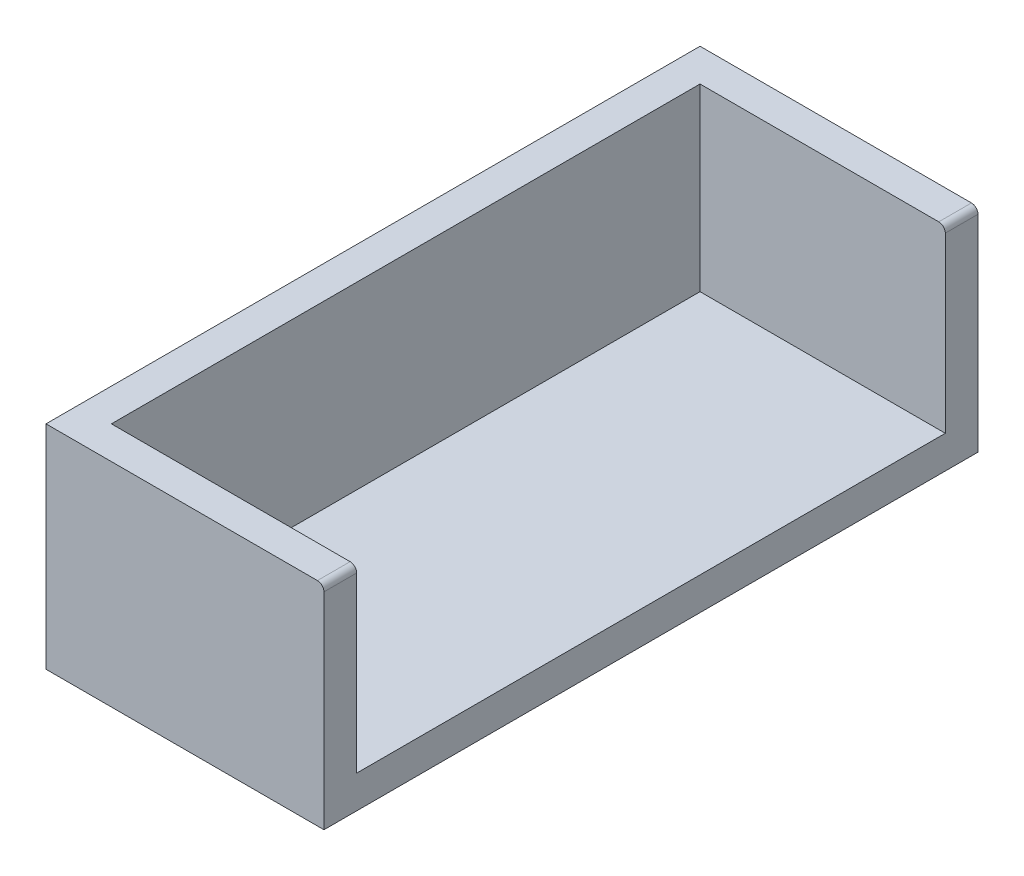
ISO-10303-21;
HEADER;
FILE_DESCRIPTION(('STEP AP214'),'2;1');
FILE_NAME('part.step','',(''),(''),'','','');
FILE_SCHEMA(('AUTOMOTIVE_DESIGN { 1 0 10303 214 1 1 1 1 }'));
ENDSEC;
DATA;
#1=APPLICATION_CONTEXT('core data for automotive mechanical design processes');
#2=APPLICATION_PROTOCOL_DEFINITION('international standard','automotive_design',2000,#1);
#3=PRODUCT_CONTEXT('',#1,'mechanical');
#4=PRODUCT('Part','Part','',(#3));
#5=PRODUCT_RELATED_PRODUCT_CATEGORY('part','',(#4));
#6=PRODUCT_DEFINITION_FORMATION('','',#4);
#7=PRODUCT_DEFINITION_CONTEXT('part definition',#1,'design');
#8=PRODUCT_DEFINITION('design','',#6,#7);
#9=PRODUCT_DEFINITION_SHAPE('','',#8);
#10=(LENGTH_UNIT() NAMED_UNIT(*) SI_UNIT(.MILLI.,.METRE.));
#11=(NAMED_UNIT(*) PLANE_ANGLE_UNIT() SI_UNIT($,.RADIAN.));
#12=(NAMED_UNIT(*) SI_UNIT($,.STERADIAN.) SOLID_ANGLE_UNIT());
#13=UNCERTAINTY_MEASURE_WITH_UNIT(LENGTH_MEASURE(1.E-05),#10,'distance_accuracy_value','');
#14=(GEOMETRIC_REPRESENTATION_CONTEXT(3) GLOBAL_UNCERTAINTY_ASSIGNED_CONTEXT((#13)) GLOBAL_UNIT_ASSIGNED_CONTEXT((#10,
#11,#12)) REPRESENTATION_CONTEXT('',''));
#15=CARTESIAN_POINT('',(0.,0.,0.));
#16=DIRECTION('',(0.,0.,1.));
#17=DIRECTION('',(1.,0.,0.));
#18=AXIS2_PLACEMENT_3D('',#15,#16,#17);
#19=CARTESIAN_POINT('',(830.,630.,2000.));
#20=DIRECTION('',(0.,0.,-1.));
#21=DIRECTION('',(-1.,0.,0.));
#22=AXIS2_PLACEMENT_3D('',#19,#20,#21);
#23=CYLINDRICAL_SURFACE('',#22,20.);
#24=DIRECTION('',(0.,0.,-1.));
#25=VECTOR('',#24,1.);
#26=CARTESIAN_POINT('',(830.,650.,2000.));
#27=LINE('',#26,#25);
#28=CARTESIAN_POINT('',(830.,650.,100.));
#29=VERTEX_POINT('',#28);
#30=CARTESIAN_POINT('',(830.,650.,0.));
#31=VERTEX_POINT('',#30);
#32=EDGE_CURVE('E145',#29,#31,#27,.T.);
#33=ORIENTED_EDGE('',*,*,#32,.F.);
#34=CARTESIAN_POINT('',(830.,630.,100.));
#35=DIRECTION('',(0.,0.,-1.));
#36=DIRECTION('',(-1.,0.,0.));
#37=AXIS2_PLACEMENT_3D('',#34,#35,#36);
#38=CIRCLE('',#37,20.);
#39=CARTESIAN_POINT('',(850.,630.,100.));
#40=VERTEX_POINT('',#39);
#41=EDGE_CURVE('E184',#29,#40,#38,.T.);
#42=ORIENTED_EDGE('',*,*,#41,.T.);
#43=DIRECTION('',(0.,0.,-1.));
#44=VECTOR('',#43,1.);
#45=CARTESIAN_POINT('',(850.,630.,2000.));
#46=LINE('',#45,#44);
#47=CARTESIAN_POINT('',(850.,630.,0.));
#48=VERTEX_POINT('',#47);
#49=EDGE_CURVE('E120',#40,#48,#46,.T.);
#50=ORIENTED_EDGE('',*,*,#49,.T.);
#51=CARTESIAN_POINT('',(830.,630.,0.));
#52=DIRECTION('',(0.,0.,1.));
#53=DIRECTION('',(-1.,0.,0.));
#54=AXIS2_PLACEMENT_3D('',#51,#52,#53);
#55=CIRCLE('',#54,20.);
#56=EDGE_CURVE('E139',#48,#31,#55,.T.);
#57=ORIENTED_EDGE('',*,*,#56,.T.);
#58=EDGE_LOOP('',(#33,#42,#50,#57));
#59=FACE_BOUND('',#58,.T.);
#60=ADVANCED_FACE('F37',(#59),#23,.T.);
#61=CARTESIAN_POINT('',(0.,0.,2000.));
#62=DIRECTION('',(1.,0.,0.));
#63=DIRECTION('',(0.,0.,-1.));
#64=AXIS2_PLACEMENT_3D('',#61,#62,#63);
#65=PLANE('',#64);
#66=DIRECTION('',(0.,-1.,0.));
#67=VECTOR('',#66,1.);
#68=CARTESIAN_POINT('',(0.,0.,0.));
#69=LINE('',#68,#67);
#70=CARTESIAN_POINT('',(0.,650.,0.));
#71=VERTEX_POINT('',#70);
#72=CARTESIAN_POINT('',(0.,0.,0.));
#73=VERTEX_POINT('',#72);
#74=EDGE_CURVE('E130',#71,#73,#69,.T.);
#75=ORIENTED_EDGE('',*,*,#74,.T.);
#76=DIRECTION('',(0.,0.,-1.));
#77=VECTOR('',#76,1.);
#78=CARTESIAN_POINT('',(0.,0.,2000.));
#79=LINE('',#78,#77);
#80=CARTESIAN_POINT('',(0.,0.,2000.));
#81=VERTEX_POINT('',#80);
#82=EDGE_CURVE('E148',#81,#73,#79,.T.);
#83=ORIENTED_EDGE('',*,*,#82,.F.);
#84=DIRECTION('',(0.,-1.,0.));
#85=VECTOR('',#84,1.);
#86=CARTESIAN_POINT('',(0.,0.,2000.));
#87=LINE('',#86,#85);
#88=CARTESIAN_POINT('',(0.,650.,2000.));
#89=VERTEX_POINT('',#88);
#90=EDGE_CURVE('E143',#89,#81,#87,.T.);
#91=ORIENTED_EDGE('',*,*,#90,.F.);
#92=DIRECTION('',(0.,0.,-1.));
#93=VECTOR('',#92,1.);
#94=CARTESIAN_POINT('',(0.,650.,2000.));
#95=LINE('',#94,#93);
#96=EDGE_CURVE('E126',#89,#71,#95,.T.);
#97=ORIENTED_EDGE('',*,*,#96,.T.);
#98=EDGE_LOOP('',(#75,#83,#91,#97));
#99=FACE_BOUND('',#98,.T.);
#100=ADVANCED_FACE('F39',(#99),#65,.F.);
#101=CARTESIAN_POINT('',(0.,0.,2000.));
#102=DIRECTION('',(0.,1.,0.));
#103=DIRECTION('',(0.,0.,1.));
#104=AXIS2_PLACEMENT_3D('',#101,#102,#103);
#105=PLANE('',#104);
#106=CARTESIAN_POINT('',(150.,0.,150.));
#107=DIRECTION('',(0.,1.,0.));
#108=DIRECTION('',(0.,0.,1.));
#109=AXIS2_PLACEMENT_3D('',#106,#107,#108);
#110=CIRCLE('',#109,40.);
#111=CARTESIAN_POINT('',(150.,0.,190.));
#112=VERTEX_POINT('',#111);
#113=EDGE_CURVE('E11',#112,#112,#110,.F.);
#114=ORIENTED_EDGE('',*,*,#113,.F.);
#115=EDGE_LOOP('',(#114));
#116=FACE_BOUND('',#115,.T.);
#117=CARTESIAN_POINT('',(700.,0.,150.));
#118=DIRECTION('',(0.,1.,0.));
#119=DIRECTION('',(0.,0.,1.));
#120=AXIS2_PLACEMENT_3D('',#117,#118,#119);
#121=CIRCLE('',#120,40.);
#122=CARTESIAN_POINT('',(700.,0.,190.));
#123=VERTEX_POINT('',#122);
#124=EDGE_CURVE('E45',#123,#123,#121,.F.);
#125=ORIENTED_EDGE('',*,*,#124,.F.);
#126=EDGE_LOOP('',(#125));
#127=FACE_BOUND('',#126,.T.);
#128=CARTESIAN_POINT('',(700.,0.,1850.));
#129=DIRECTION('',(0.,1.,0.));
#130=DIRECTION('',(0.,0.,1.));
#131=AXIS2_PLACEMENT_3D('',#128,#129,#130);
#132=CIRCLE('',#131,40.);
#133=CARTESIAN_POINT('',(700.,0.,1890.));
#134=VERTEX_POINT('',#133);
#135=EDGE_CURVE('E159',#134,#134,#132,.F.);
#136=ORIENTED_EDGE('',*,*,#135,.F.);
#137=EDGE_LOOP('',(#136));
#138=FACE_BOUND('',#137,.T.);
#139=CARTESIAN_POINT('',(150.,0.,1850.));
#140=DIRECTION('',(0.,1.,0.));
#141=DIRECTION('',(0.,0.,1.));
#142=AXIS2_PLACEMENT_3D('',#139,#140,#141);
#143=CIRCLE('',#142,40.);
#144=CARTESIAN_POINT('',(150.,0.,1890.));
#145=VERTEX_POINT('',#144);
#146=EDGE_CURVE('E156',#145,#145,#143,.F.);
#147=ORIENTED_EDGE('',*,*,#146,.F.);
#148=EDGE_LOOP('',(#147));
#149=FACE_BOUND('',#148,.T.);
#150=DIRECTION('',(1.,0.,0.));
#151=VECTOR('',#150,1.);
#152=CARTESIAN_POINT('',(0.,0.,0.));
#153=LINE('',#152,#151);
#154=CARTESIAN_POINT('',(850.,0.,0.));
#155=VERTEX_POINT('',#154);
#156=EDGE_CURVE('E133',#73,#155,#153,.T.);
#157=ORIENTED_EDGE('',*,*,#156,.T.);
#158=DIRECTION('',(0.,0.,-1.));
#159=VECTOR('',#158,1.);
#160=CARTESIAN_POINT('',(850.,0.,2000.));
#161=LINE('',#160,#159);
#162=CARTESIAN_POINT('',(850.,0.,2000.));
#163=VERTEX_POINT('',#162);
#164=EDGE_CURVE('E119',#163,#155,#161,.T.);
#165=ORIENTED_EDGE('',*,*,#164,.F.);
#166=DIRECTION('',(1.,0.,0.));
#167=VECTOR('',#166,1.);
#168=CARTESIAN_POINT('',(0.,0.,2000.));
#169=LINE('',#168,#167);
#170=EDGE_CURVE('E93',#81,#163,#169,.T.);
#171=ORIENTED_EDGE('',*,*,#170,.F.);
#172=ORIENTED_EDGE('',*,*,#82,.T.);
#173=EDGE_LOOP('',(#157,#165,#171,#172));
#174=FACE_BOUND('',#173,.T.);
#175=ADVANCED_FACE('F166',(#116,#127,#138,#149,#174),#105,.F.);
#176=CARTESIAN_POINT('',(850.,0.,2000.));
#177=DIRECTION('',(-1.,0.,0.));
#178=DIRECTION('',(0.,0.,1.));
#179=AXIS2_PLACEMENT_3D('',#176,#177,#178);
#180=PLANE('',#179);
#181=ORIENTED_EDGE('',*,*,#49,.F.);
#182=DIRECTION('',(0.,-1.,0.));
#183=VECTOR('',#182,1.);
#184=CARTESIAN_POINT('',(850.,0.,100.));
#185=LINE('',#184,#183);
#186=CARTESIAN_POINT('',(850.,100.,100.));
#187=VERTEX_POINT('',#186);
#188=EDGE_CURVE('E134',#40,#187,#185,.T.);
#189=ORIENTED_EDGE('',*,*,#188,.T.);
#190=DIRECTION('',(0.,0.,-1.));
#191=VECTOR('',#190,1.);
#192=CARTESIAN_POINT('',(850.,100.,2000.));
#193=LINE('',#192,#191);
#194=CARTESIAN_POINT('',(850.,100.,1900.));
#195=VERTEX_POINT('',#194);
#196=EDGE_CURVE('E153',#195,#187,#193,.T.);
#197=ORIENTED_EDGE('',*,*,#196,.F.);
#198=DIRECTION('',(0.,1.,0.));
#199=VECTOR('',#198,1.);
#200=CARTESIAN_POINT('',(850.,0.,1900.));
#201=LINE('',#200,#199);
#202=CARTESIAN_POINT('',(850.,630.,1900.));
#203=VERTEX_POINT('',#202);
#204=EDGE_CURVE('E116',#195,#203,#201,.T.);
#205=ORIENTED_EDGE('',*,*,#204,.T.);
#206=CARTESIAN_POINT('',(850.,630.,2000.));
#207=VERTEX_POINT('',#206);
#208=EDGE_CURVE('E110',#207,#203,#46,.T.);
#209=ORIENTED_EDGE('',*,*,#208,.F.);
#210=DIRECTION('',(0.,1.,0.));
#211=VECTOR('',#210,1.);
#212=CARTESIAN_POINT('',(850.,0.,2000.));
#213=LINE('',#212,#211);
#214=EDGE_CURVE('E99',#163,#207,#213,.T.);
#215=ORIENTED_EDGE('',*,*,#214,.F.);
#216=ORIENTED_EDGE('',*,*,#164,.T.);
#217=DIRECTION('',(0.,1.,0.));
#218=VECTOR('',#217,1.);
#219=CARTESIAN_POINT('',(850.,0.,0.));
#220=LINE('',#219,#218);
#221=EDGE_CURVE('E136',#155,#48,#220,.T.);
#222=ORIENTED_EDGE('',*,*,#221,.T.);
#223=EDGE_LOOP('',(#181,#189,#197,#205,#209,#215,#216,#222));
#224=FACE_BOUND('',#223,.T.);
#225=ADVANCED_FACE('F112',(#224),#180,.F.);
#226=ORIENTED_EDGE('',*,*,#208,.T.);
#227=CARTESIAN_POINT('',(830.,630.,1900.));
#228=DIRECTION('',(0.,0.,1.));
#229=DIRECTION('',(1.,0.,0.));
#230=AXIS2_PLACEMENT_3D('',#227,#228,#229);
#231=CIRCLE('',#230,20.);
#232=CARTESIAN_POINT('',(830.,650.,1900.));
#233=VERTEX_POINT('',#232);
#234=EDGE_CURVE('E233',#203,#233,#231,.T.);
#235=ORIENTED_EDGE('',*,*,#234,.T.);
#236=CARTESIAN_POINT('',(830.,650.,2000.));
#237=VERTEX_POINT('',#236);
#238=EDGE_CURVE('E124',#237,#233,#27,.T.);
#239=ORIENTED_EDGE('',*,*,#238,.F.);
#240=CARTESIAN_POINT('',(830.,630.,2000.));
#241=DIRECTION('',(0.,0.,1.));
#242=DIRECTION('',(-1.,0.,0.));
#243=AXIS2_PLACEMENT_3D('',#240,#241,#242);
#244=CIRCLE('',#243,20.);
#245=EDGE_CURVE('E103',#207,#237,#244,.T.);
#246=ORIENTED_EDGE('',*,*,#245,.F.);
#247=EDGE_LOOP('',(#226,#235,#239,#246));
#248=FACE_BOUND('',#247,.T.);
#249=ADVANCED_FACE('F122',(#248),#23,.T.);
#250=CARTESIAN_POINT('',(0.,650.,2000.));
#251=DIRECTION('',(0.,-1.,0.));
#252=DIRECTION('',(0.,0.,-1.));
#253=AXIS2_PLACEMENT_3D('',#250,#251,#252);
#254=PLANE('',#253);
#255=DIRECTION('',(0.,0.,1.));
#256=VECTOR('',#255,1.);
#257=CARTESIAN_POINT('',(100.,650.,100.));
#258=LINE('',#257,#256);
#259=CARTESIAN_POINT('',(100.,650.,100.));
#260=VERTEX_POINT('',#259);
#261=CARTESIAN_POINT('',(100.,650.,1900.));
#262=VERTEX_POINT('',#261);
#263=EDGE_CURVE('E52',#260,#262,#258,.T.);
#264=ORIENTED_EDGE('',*,*,#263,.F.);
#265=DIRECTION('',(1.,0.,0.));
#266=VECTOR('',#265,1.);
#267=CARTESIAN_POINT('',(0.,650.,100.));
#268=LINE('',#267,#266);
#269=EDGE_CURVE('E150',#260,#29,#268,.T.);
#270=ORIENTED_EDGE('',*,*,#269,.T.);
#271=ORIENTED_EDGE('',*,*,#32,.T.);
#272=DIRECTION('',(-1.,0.,0.));
#273=VECTOR('',#272,1.);
#274=CARTESIAN_POINT('',(0.,650.,0.));
#275=LINE('',#274,#273);
#276=EDGE_CURVE('E84',#31,#71,#275,.T.);
#277=ORIENTED_EDGE('',*,*,#276,.T.);
#278=ORIENTED_EDGE('',*,*,#96,.F.);
#279=DIRECTION('',(-1.,0.,0.));
#280=VECTOR('',#279,1.);
#281=CARTESIAN_POINT('',(0.,650.,2000.));
#282=LINE('',#281,#280);
#283=EDGE_CURVE('E61',#237,#89,#282,.T.);
#284=ORIENTED_EDGE('',*,*,#283,.F.);
#285=ORIENTED_EDGE('',*,*,#238,.T.);
#286=DIRECTION('',(1.,0.,0.));
#287=VECTOR('',#286,1.);
#288=CARTESIAN_POINT('',(100.,650.,1900.));
#289=LINE('',#288,#287);
#290=EDGE_CURVE('E224',#262,#233,#289,.T.);
#291=ORIENTED_EDGE('',*,*,#290,.F.);
#292=EDGE_LOOP('',(#264,#270,#271,#277,#278,#284,#285,#291));
#293=FACE_BOUND('',#292,.T.);
#294=ADVANCED_FACE('F241',(#293),#254,.F.);
#295=CARTESIAN_POINT('',(830.,630.,2000.));
#296=DIRECTION('',(0.,0.,-1.));
#297=DIRECTION('',(-1.,0.,0.));
#298=AXIS2_PLACEMENT_3D('',#295,#296,#297);
#299=PLANE('',#298);
#300=ORIENTED_EDGE('',*,*,#90,.T.);
#301=ORIENTED_EDGE('',*,*,#170,.T.);
#302=ORIENTED_EDGE('',*,*,#214,.T.);
#303=ORIENTED_EDGE('',*,*,#245,.T.);
#304=ORIENTED_EDGE('',*,*,#283,.T.);
#305=EDGE_LOOP('',(#300,#301,#302,#303,#304));
#306=FACE_BOUND('',#305,.T.);
#307=ADVANCED_FACE('F101',(#306),#299,.F.);
#308=CARTESIAN_POINT('',(830.,630.,0.));
#309=DIRECTION('',(0.,0.,-1.));
#310=DIRECTION('',(-1.,0.,0.));
#311=AXIS2_PLACEMENT_3D('',#308,#309,#310);
#312=PLANE('',#311);
#313=ORIENTED_EDGE('',*,*,#74,.F.);
#314=ORIENTED_EDGE('',*,*,#276,.F.);
#315=ORIENTED_EDGE('',*,*,#56,.F.);
#316=ORIENTED_EDGE('',*,*,#221,.F.);
#317=ORIENTED_EDGE('',*,*,#156,.F.);
#318=EDGE_LOOP('',(#313,#314,#315,#316,#317));
#319=FACE_BOUND('',#318,.T.);
#320=ADVANCED_FACE('F178',(#319),#312,.T.);
#321=CARTESIAN_POINT('',(0.,100.,0.));
#322=DIRECTION('',(0.,1.,0.));
#323=DIRECTION('',(0.,0.,1.));
#324=AXIS2_PLACEMENT_3D('',#321,#322,#323);
#325=PLANE('',#324);
#326=ORIENTED_EDGE('',*,*,#196,.T.);
#327=DIRECTION('',(-1.,0.,0.));
#328=VECTOR('',#327,1.);
#329=CARTESIAN_POINT('',(100.,100.,100.));
#330=LINE('',#329,#328);
#331=CARTESIAN_POINT('',(100.,100.,100.));
#332=VERTEX_POINT('',#331);
#333=EDGE_CURVE('E217',#187,#332,#330,.T.);
#334=ORIENTED_EDGE('',*,*,#333,.T.);
#335=DIRECTION('',(0.,0.,1.));
#336=VECTOR('',#335,1.);
#337=CARTESIAN_POINT('',(100.,100.,100.));
#338=LINE('',#337,#336);
#339=CARTESIAN_POINT('',(100.,100.,1900.));
#340=VERTEX_POINT('',#339);
#341=EDGE_CURVE('E213',#332,#340,#338,.T.);
#342=ORIENTED_EDGE('',*,*,#341,.T.);
#343=DIRECTION('',(1.,0.,0.));
#344=VECTOR('',#343,1.);
#345=CARTESIAN_POINT('',(100.,100.,1900.));
#346=LINE('',#345,#344);
#347=EDGE_CURVE('E219',#340,#195,#346,.T.);
#348=ORIENTED_EDGE('',*,*,#347,.T.);
#349=EDGE_LOOP('',(#326,#334,#342,#348));
#350=FACE_BOUND('',#349,.T.);
#351=ADVANCED_FACE('F222',(#350),#325,.T.);
#352=CARTESIAN_POINT('',(100.,100.,100.));
#353=DIRECTION('',(0.,0.,-1.));
#354=DIRECTION('',(-1.,0.,0.));
#355=AXIS2_PLACEMENT_3D('',#352,#353,#354);
#356=PLANE('',#355);
#357=ORIENTED_EDGE('',*,*,#41,.F.);
#358=ORIENTED_EDGE('',*,*,#269,.F.);
#359=DIRECTION('',(0.,1.,0.));
#360=VECTOR('',#359,1.);
#361=CARTESIAN_POINT('',(100.,100.,100.));
#362=LINE('',#361,#360);
#363=EDGE_CURVE('E216',#332,#260,#362,.T.);
#364=ORIENTED_EDGE('',*,*,#363,.F.);
#365=ORIENTED_EDGE('',*,*,#333,.F.);
#366=ORIENTED_EDGE('',*,*,#188,.F.);
#367=EDGE_LOOP('',(#357,#358,#364,#365,#366));
#368=FACE_BOUND('',#367,.T.);
#369=ADVANCED_FACE('F242',(#368),#356,.F.);
#370=CARTESIAN_POINT('',(100.,100.,1900.));
#371=DIRECTION('',(0.,0.,1.));
#372=DIRECTION('',(1.,0.,0.));
#373=AXIS2_PLACEMENT_3D('',#370,#371,#372);
#374=PLANE('',#373);
#375=ORIENTED_EDGE('',*,*,#347,.F.);
#376=DIRECTION('',(0.,1.,0.));
#377=VECTOR('',#376,1.);
#378=CARTESIAN_POINT('',(100.,100.,1900.));
#379=LINE('',#378,#377);
#380=EDGE_CURVE('E209',#340,#262,#379,.T.);
#381=ORIENTED_EDGE('',*,*,#380,.T.);
#382=ORIENTED_EDGE('',*,*,#290,.T.);
#383=ORIENTED_EDGE('',*,*,#234,.F.);
#384=ORIENTED_EDGE('',*,*,#204,.F.);
#385=EDGE_LOOP('',(#375,#381,#382,#383,#384));
#386=FACE_BOUND('',#385,.T.);
#387=ADVANCED_FACE('F220',(#386),#374,.F.);
#388=CARTESIAN_POINT('',(100.,100.,100.));
#389=DIRECTION('',(-1.,0.,0.));
#390=DIRECTION('',(0.,0.,1.));
#391=AXIS2_PLACEMENT_3D('',#388,#389,#390);
#392=PLANE('',#391);
#393=ORIENTED_EDGE('',*,*,#263,.T.);
#394=ORIENTED_EDGE('',*,*,#380,.F.);
#395=ORIENTED_EDGE('',*,*,#341,.F.);
#396=ORIENTED_EDGE('',*,*,#363,.T.);
#397=EDGE_LOOP('',(#393,#394,#395,#396));
#398=FACE_BOUND('',#397,.T.);
#399=ADVANCED_FACE('F211',(#398),#392,.F.);
#400=CARTESIAN_POINT('',(150.,-20.,1850.));
#401=DIRECTION('',(0.,1.,0.));
#402=DIRECTION('',(0.,0.,1.));
#403=AXIS2_PLACEMENT_3D('',#400,#401,#402);
#404=CYLINDRICAL_SURFACE('',#403,40.);
#405=CARTESIAN_POINT('',(150.,-20.,1850.));
#406=DIRECTION('',(0.,-1.,0.));
#407=DIRECTION('',(0.,0.,-1.));
#408=AXIS2_PLACEMENT_3D('',#405,#406,#407);
#409=CIRCLE('',#408,40.);
#410=CARTESIAN_POINT('',(150.,-20.,1810.));
#411=VERTEX_POINT('',#410);
#412=EDGE_CURVE('E228',#411,#411,#409,.T.);
#413=ORIENTED_EDGE('',*,*,#412,.F.);
#414=EDGE_LOOP('',(#413));
#415=FACE_BOUND('',#414,.T.);
#416=ORIENTED_EDGE('',*,*,#146,.T.);
#417=EDGE_LOOP('',(#416));
#418=FACE_BOUND('',#417,.T.);
#419=ADVANCED_FACE('F325',(#415,#418),#404,.T.);
#420=CARTESIAN_POINT('',(150.,-20.,1850.));
#421=DIRECTION('',(0.,-1.,0.));
#422=DIRECTION('',(0.,0.,-1.));
#423=AXIS2_PLACEMENT_3D('',#420,#421,#422);
#424=PLANE('',#423);
#425=ORIENTED_EDGE('',*,*,#412,.T.);
#426=EDGE_LOOP('',(#425));
#427=FACE_BOUND('',#426,.T.);
#428=ADVANCED_FACE('F333',(#427),#424,.T.);
#429=CARTESIAN_POINT('',(700.,-20.,1850.));
#430=DIRECTION('',(0.,1.,0.));
#431=DIRECTION('',(0.,0.,1.));
#432=AXIS2_PLACEMENT_3D('',#429,#430,#431);
#433=CYLINDRICAL_SURFACE('',#432,40.);
#434=CARTESIAN_POINT('',(700.,-20.,1850.));
#435=DIRECTION('',(0.,-1.,0.));
#436=DIRECTION('',(0.,0.,1.));
#437=AXIS2_PLACEMENT_3D('',#434,#435,#436);
#438=CIRCLE('',#437,40.);
#439=CARTESIAN_POINT('',(700.,-20.,1890.));
#440=VERTEX_POINT('',#439);
#441=EDGE_CURVE('E428',#440,#440,#438,.T.);
#442=ORIENTED_EDGE('',*,*,#441,.F.);
#443=EDGE_LOOP('',(#442));
#444=FACE_BOUND('',#443,.T.);
#445=ORIENTED_EDGE('',*,*,#135,.T.);
#446=EDGE_LOOP('',(#445));
#447=FACE_BOUND('',#446,.T.);
#448=ADVANCED_FACE('F342',(#444,#447),#433,.T.);
#449=CARTESIAN_POINT('',(700.,-20.,1850.));
#450=DIRECTION('',(0.,1.,0.));
#451=DIRECTION('',(0.,0.,1.));
#452=AXIS2_PLACEMENT_3D('',#449,#450,#451);
#453=PLANE('',#452);
#454=ORIENTED_EDGE('',*,*,#441,.T.);
#455=EDGE_LOOP('',(#454));
#456=FACE_BOUND('',#455,.T.);
#457=ADVANCED_FACE('F351',(#456),#453,.F.);
#458=CARTESIAN_POINT('',(700.,-20.,150.));
#459=DIRECTION('',(0.,1.,0.));
#460=DIRECTION('',(0.,0.,1.));
#461=AXIS2_PLACEMENT_3D('',#458,#459,#460);
#462=CYLINDRICAL_SURFACE('',#461,40.);
#463=CARTESIAN_POINT('',(700.,-20.,150.));
#464=DIRECTION('',(0.,-1.,0.));
#465=DIRECTION('',(0.,0.,-1.));
#466=AXIS2_PLACEMENT_3D('',#463,#464,#465);
#467=CIRCLE('',#466,40.);
#468=CARTESIAN_POINT('',(700.,-20.,110.));
#469=VERTEX_POINT('',#468);
#470=EDGE_CURVE('E425',#469,#469,#467,.T.);
#471=ORIENTED_EDGE('',*,*,#470,.F.);
#472=EDGE_LOOP('',(#471));
#473=FACE_BOUND('',#472,.T.);
#474=ORIENTED_EDGE('',*,*,#124,.T.);
#475=EDGE_LOOP('',(#474));
#476=FACE_BOUND('',#475,.T.);
#477=ADVANCED_FACE('F164',(#473,#476),#462,.T.);
#478=CARTESIAN_POINT('',(700.,-20.,150.));
#479=DIRECTION('',(0.,-1.,0.));
#480=DIRECTION('',(0.,0.,-1.));
#481=AXIS2_PLACEMENT_3D('',#478,#479,#480);
#482=PLANE('',#481);
#483=ORIENTED_EDGE('',*,*,#470,.T.);
#484=EDGE_LOOP('',(#483));
#485=FACE_BOUND('',#484,.T.);
#486=ADVANCED_FACE('F368',(#485),#482,.T.);
#487=CARTESIAN_POINT('',(150.,-20.,150.));
#488=DIRECTION('',(0.,1.,0.));
#489=DIRECTION('',(0.,0.,1.));
#490=AXIS2_PLACEMENT_3D('',#487,#488,#489);
#491=CYLINDRICAL_SURFACE('',#490,40.);
#492=CARTESIAN_POINT('',(150.,-20.,150.));
#493=DIRECTION('',(0.,-1.,0.));
#494=DIRECTION('',(0.,0.,1.));
#495=AXIS2_PLACEMENT_3D('',#492,#493,#494);
#496=CIRCLE('',#495,40.);
#497=CARTESIAN_POINT('',(150.,-20.,190.));
#498=VERTEX_POINT('',#497);
#499=EDGE_CURVE('E424',#498,#498,#496,.T.);
#500=ORIENTED_EDGE('',*,*,#499,.F.);
#501=EDGE_LOOP('',(#500));
#502=FACE_BOUND('',#501,.T.);
#503=ORIENTED_EDGE('',*,*,#113,.T.);
#504=EDGE_LOOP('',(#503));
#505=FACE_BOUND('',#504,.T.);
#506=ADVANCED_FACE('F377',(#502,#505),#491,.T.);
#507=CARTESIAN_POINT('',(150.,-20.,150.));
#508=DIRECTION('',(0.,1.,0.));
#509=DIRECTION('',(0.,0.,1.));
#510=AXIS2_PLACEMENT_3D('',#507,#508,#509);
#511=PLANE('',#510);
#512=ORIENTED_EDGE('',*,*,#499,.T.);
#513=EDGE_LOOP('',(#512));
#514=FACE_BOUND('',#513,.T.);
#515=ADVANCED_FACE('F386',(#514),#511,.F.);
#516=CLOSED_SHELL('',(#60,#100,#175,#225,#249,#294,#307,#320,#351,#369,#387,#399,#419,#428,#448,
#457,#477,#486,#506,#515));
#517=MANIFOLD_SOLID_BREP('B2',#516);
#518=ADVANCED_BREP_SHAPE_REPRESENTATION('',(#18,#517),#14);
#519=SHAPE_DEFINITION_REPRESENTATION(#9,#518);
ENDSEC;
END-ISO-10303-21;
